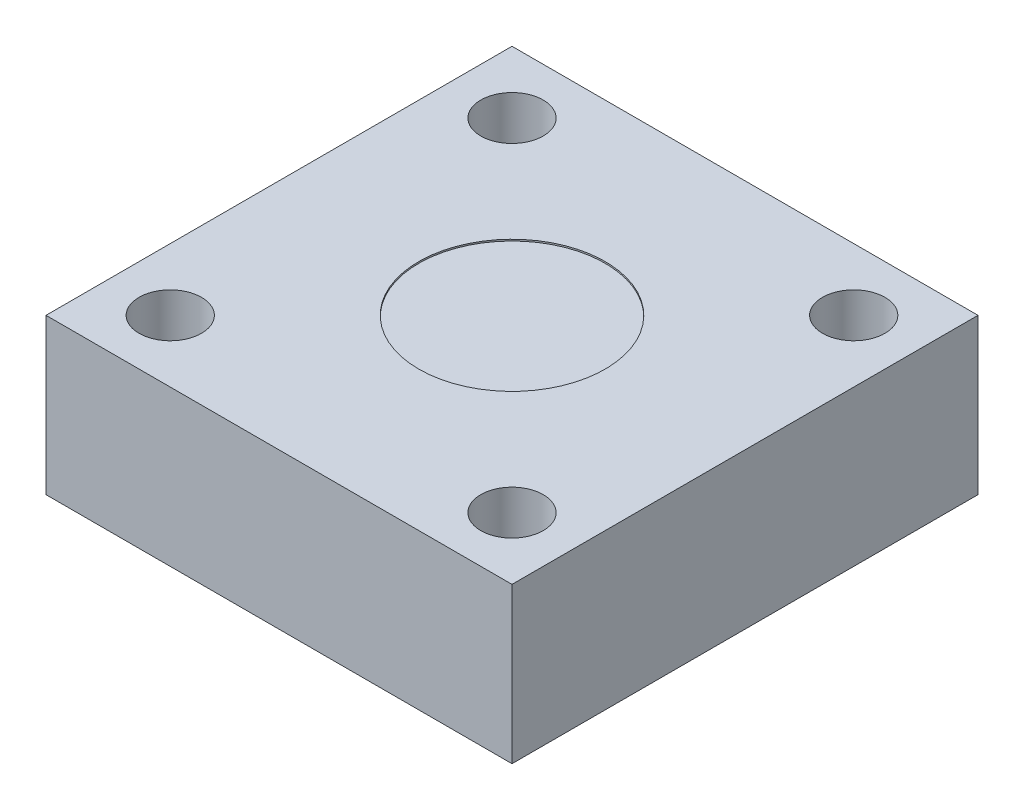
ISO-10303-21;
HEADER;
FILE_DESCRIPTION(('STEP AP214'),'2;1');
FILE_NAME('part.step','',(''),(''),'','','');
FILE_SCHEMA(('AUTOMOTIVE_DESIGN { 1 0 10303 214 1 1 1 1 }'));
ENDSEC;
DATA;
#1=APPLICATION_CONTEXT('core data for automotive mechanical design processes');
#2=APPLICATION_PROTOCOL_DEFINITION('international standard','automotive_design',2000,#1);
#3=PRODUCT_CONTEXT('',#1,'mechanical');
#4=PRODUCT('Part','Part','',(#3));
#5=PRODUCT_RELATED_PRODUCT_CATEGORY('part','',(#4));
#6=PRODUCT_DEFINITION_FORMATION('','',#4);
#7=PRODUCT_DEFINITION_CONTEXT('part definition',#1,'design');
#8=PRODUCT_DEFINITION('design','',#6,#7);
#9=PRODUCT_DEFINITION_SHAPE('','',#8);
#10=(LENGTH_UNIT() NAMED_UNIT(*) SI_UNIT(.MILLI.,.METRE.));
#11=(NAMED_UNIT(*) PLANE_ANGLE_UNIT() SI_UNIT($,.RADIAN.));
#12=(NAMED_UNIT(*) SI_UNIT($,.STERADIAN.) SOLID_ANGLE_UNIT());
#13=UNCERTAINTY_MEASURE_WITH_UNIT(LENGTH_MEASURE(1.E-05),#10,'distance_accuracy_value','');
#14=(GEOMETRIC_REPRESENTATION_CONTEXT(3) GLOBAL_UNCERTAINTY_ASSIGNED_CONTEXT((#13)) GLOBAL_UNIT_ASSIGNED_CONTEXT((#10,
#11,#12)) REPRESENTATION_CONTEXT('',''));
#15=CARTESIAN_POINT('',(0.,0.,0.));
#16=DIRECTION('',(0.,0.,1.));
#17=DIRECTION('',(1.,0.,0.));
#18=AXIS2_PLACEMENT_3D('',#15,#16,#17);
#19=CARTESIAN_POINT('',(19.05,12.7,-19.05));
#20=DIRECTION('',(-1.,0.,0.));
#21=DIRECTION('',(0.,0.,1.));
#22=AXIS2_PLACEMENT_3D('',#19,#20,#21);
#23=PLANE('',#22);
#24=DIRECTION('',(0.,0.,-1.));
#25=VECTOR('',#24,1.);
#26=CARTESIAN_POINT('',(19.05,0.,-19.05));
#27=LINE('',#26,#25);
#28=CARTESIAN_POINT('',(19.05,0.,19.05));
#29=VERTEX_POINT('',#28);
#30=CARTESIAN_POINT('',(19.05,0.,-19.05));
#31=VERTEX_POINT('',#30);
#32=EDGE_CURVE('E142',#29,#31,#27,.T.);
#33=ORIENTED_EDGE('',*,*,#32,.T.);
#34=DIRECTION('',(0.,-1.,0.));
#35=VECTOR('',#34,1.);
#36=CARTESIAN_POINT('',(19.05,12.7,-19.05));
#37=LINE('',#36,#35);
#38=CARTESIAN_POINT('',(19.05,12.7,-19.05));
#39=VERTEX_POINT('',#38);
#40=EDGE_CURVE('E13',#39,#31,#37,.T.);
#41=ORIENTED_EDGE('',*,*,#40,.F.);
#42=DIRECTION('',(0.,0.,-1.));
#43=VECTOR('',#42,1.);
#44=CARTESIAN_POINT('',(19.05,12.7,-19.05));
#45=LINE('',#44,#43);
#46=CARTESIAN_POINT('',(19.05,12.7,19.05));
#47=VERTEX_POINT('',#46);
#48=EDGE_CURVE('E145',#47,#39,#45,.T.);
#49=ORIENTED_EDGE('',*,*,#48,.F.);
#50=DIRECTION('',(0.,-1.,0.));
#51=VECTOR('',#50,1.);
#52=CARTESIAN_POINT('',(19.05,12.7,19.05));
#53=LINE('',#52,#51);
#54=EDGE_CURVE('E151',#47,#29,#53,.T.);
#55=ORIENTED_EDGE('',*,*,#54,.T.);
#56=EDGE_LOOP('',(#33,#41,#49,#55));
#57=FACE_BOUND('',#56,.T.);
#58=ADVANCED_FACE('F45',(#57),#23,.F.);
#59=CARTESIAN_POINT('',(-19.05,12.7,-19.05));
#60=DIRECTION('',(0.,0.,1.));
#61=DIRECTION('',(1.,0.,0.));
#62=AXIS2_PLACEMENT_3D('',#59,#60,#61);
#63=PLANE('',#62);
#64=DIRECTION('',(-1.,0.,0.));
#65=VECTOR('',#64,1.);
#66=CARTESIAN_POINT('',(-19.05,0.,-19.05));
#67=LINE('',#66,#65);
#68=CARTESIAN_POINT('',(-19.05,0.,-19.05));
#69=VERTEX_POINT('',#68);
#70=EDGE_CURVE('E154',#31,#69,#67,.T.);
#71=ORIENTED_EDGE('',*,*,#70,.T.);
#72=DIRECTION('',(0.,-1.,0.));
#73=VECTOR('',#72,1.);
#74=CARTESIAN_POINT('',(-19.05,12.7,-19.05));
#75=LINE('',#74,#73);
#76=CARTESIAN_POINT('',(-19.05,12.7,-19.05));
#77=VERTEX_POINT('',#76);
#78=EDGE_CURVE('E53',#77,#69,#75,.T.);
#79=ORIENTED_EDGE('',*,*,#78,.F.);
#80=DIRECTION('',(-1.,0.,0.));
#81=VECTOR('',#80,1.);
#82=CARTESIAN_POINT('',(-19.05,12.7,-19.05));
#83=LINE('',#82,#81);
#84=EDGE_CURVE('E92',#39,#77,#83,.T.);
#85=ORIENTED_EDGE('',*,*,#84,.F.);
#86=ORIENTED_EDGE('',*,*,#40,.T.);
#87=EDGE_LOOP('',(#71,#79,#85,#86));
#88=FACE_BOUND('',#87,.T.);
#89=ADVANCED_FACE('F178',(#88),#63,.F.);
#90=CARTESIAN_POINT('',(-19.05,12.7,-19.05));
#91=DIRECTION('',(1.,0.,0.));
#92=DIRECTION('',(0.,0.,-1.));
#93=AXIS2_PLACEMENT_3D('',#90,#91,#92);
#94=PLANE('',#93);
#95=DIRECTION('',(0.,0.,1.));
#96=VECTOR('',#95,1.);
#97=CARTESIAN_POINT('',(-19.05,0.,-19.05));
#98=LINE('',#97,#96);
#99=CARTESIAN_POINT('',(-19.05,0.,19.05));
#100=VERTEX_POINT('',#99);
#101=EDGE_CURVE('E79',#69,#100,#98,.T.);
#102=ORIENTED_EDGE('',*,*,#101,.T.);
#103=DIRECTION('',(0.,-1.,0.));
#104=VECTOR('',#103,1.);
#105=CARTESIAN_POINT('',(-19.05,12.7,19.05));
#106=LINE('',#105,#104);
#107=CARTESIAN_POINT('',(-19.05,12.7,19.05));
#108=VERTEX_POINT('',#107);
#109=EDGE_CURVE('E159',#108,#100,#106,.T.);
#110=ORIENTED_EDGE('',*,*,#109,.F.);
#111=DIRECTION('',(0.,0.,1.));
#112=VECTOR('',#111,1.);
#113=CARTESIAN_POINT('',(-19.05,12.7,-19.05));
#114=LINE('',#113,#112);
#115=EDGE_CURVE('E148',#77,#108,#114,.T.);
#116=ORIENTED_EDGE('',*,*,#115,.F.);
#117=ORIENTED_EDGE('',*,*,#78,.T.);
#118=EDGE_LOOP('',(#102,#110,#116,#117));
#119=FACE_BOUND('',#118,.T.);
#120=ADVANCED_FACE('F161',(#119),#94,.F.);
#121=CARTESIAN_POINT('',(-19.05,12.7,19.05));
#122=DIRECTION('',(0.,0.,-1.));
#123=DIRECTION('',(-1.,0.,0.));
#124=AXIS2_PLACEMENT_3D('',#121,#122,#123);
#125=PLANE('',#124);
#126=DIRECTION('',(1.,0.,0.));
#127=VECTOR('',#126,1.);
#128=CARTESIAN_POINT('',(-19.05,0.,19.05));
#129=LINE('',#128,#127);
#130=EDGE_CURVE('E85',#100,#29,#129,.T.);
#131=ORIENTED_EDGE('',*,*,#130,.T.);
#132=ORIENTED_EDGE('',*,*,#54,.F.);
#133=DIRECTION('',(1.,0.,0.));
#134=VECTOR('',#133,1.);
#135=CARTESIAN_POINT('',(-19.05,12.7,19.05));
#136=LINE('',#135,#134);
#137=EDGE_CURVE('E61',#108,#47,#136,.T.);
#138=ORIENTED_EDGE('',*,*,#137,.F.);
#139=ORIENTED_EDGE('',*,*,#109,.T.);
#140=EDGE_LOOP('',(#131,#132,#138,#139));
#141=FACE_BOUND('',#140,.T.);
#142=ADVANCED_FACE('F168',(#141),#125,.F.);
#143=CARTESIAN_POINT('',(0.,12.7,0.));
#144=DIRECTION('',(0.,1.,0.));
#145=DIRECTION('',(0.,0.,1.));
#146=AXIS2_PLACEMENT_3D('',#143,#144,#145);
#147=PLANE('',#146);
#148=CARTESIAN_POINT('',(-13.97,12.7,-13.97));
#149=DIRECTION('',(0.,1.,0.));
#150=DIRECTION('',(0.,0.,1.));
#151=AXIS2_PLACEMENT_3D('',#148,#149,#150);
#152=CIRCLE('',#151,2.55269999999999);
#153=CARTESIAN_POINT('',(-13.97,12.7,-11.4173));
#154=VERTEX_POINT('',#153);
#155=EDGE_CURVE('E116',#154,#154,#152,.T.);
#156=ORIENTED_EDGE('',*,*,#155,.F.);
#157=EDGE_LOOP('',(#156));
#158=FACE_BOUND('',#157,.T.);
#159=CARTESIAN_POINT('',(13.97,12.7,-13.97));
#160=DIRECTION('',(0.,1.,0.));
#161=DIRECTION('',(0.,0.,1.));
#162=AXIS2_PLACEMENT_3D('',#159,#160,#161);
#163=CIRCLE('',#162,2.55269999999999);
#164=CARTESIAN_POINT('',(13.97,12.7,-11.4173));
#165=VERTEX_POINT('',#164);
#166=EDGE_CURVE('E115',#165,#165,#163,.T.);
#167=ORIENTED_EDGE('',*,*,#166,.F.);
#168=EDGE_LOOP('',(#167));
#169=FACE_BOUND('',#168,.T.);
#170=CARTESIAN_POINT('',(13.97,12.7,13.97));
#171=DIRECTION('',(0.,1.,0.));
#172=DIRECTION('',(0.,0.,1.));
#173=AXIS2_PLACEMENT_3D('',#170,#171,#172);
#174=CIRCLE('',#173,2.55269999999999);
#175=CARTESIAN_POINT('',(13.97,12.7,16.5227));
#176=VERTEX_POINT('',#175);
#177=EDGE_CURVE('E126',#176,#176,#174,.T.);
#178=ORIENTED_EDGE('',*,*,#177,.F.);
#179=EDGE_LOOP('',(#178));
#180=FACE_BOUND('',#179,.T.);
#181=CARTESIAN_POINT('',(-13.97,12.7,13.97));
#182=DIRECTION('',(0.,1.,0.));
#183=DIRECTION('',(0.,0.,1.));
#184=AXIS2_PLACEMENT_3D('',#181,#182,#183);
#185=CIRCLE('',#184,2.55269999999999);
#186=CARTESIAN_POINT('',(-13.97,12.7,16.5227));
#187=VERTEX_POINT('',#186);
#188=EDGE_CURVE('E132',#187,#187,#185,.T.);
#189=ORIENTED_EDGE('',*,*,#188,.F.);
#190=EDGE_LOOP('',(#189));
#191=FACE_BOUND('',#190,.T.);
#192=CARTESIAN_POINT('',(0.,12.7,0.));
#193=DIRECTION('',(0.,1.,0.));
#194=DIRECTION('',(0.,0.,1.));
#195=AXIS2_PLACEMENT_3D('',#192,#193,#194);
#196=CIRCLE('',#195,7.62);
#197=CARTESIAN_POINT('',(0.,12.7,7.62));
#198=VERTEX_POINT('',#197);
#199=EDGE_CURVE('E138',#198,#198,#196,.T.);
#200=ORIENTED_EDGE('',*,*,#199,.F.);
#201=EDGE_LOOP('',(#200));
#202=FACE_BOUND('',#201,.T.);
#203=ORIENTED_EDGE('',*,*,#48,.T.);
#204=ORIENTED_EDGE('',*,*,#84,.T.);
#205=ORIENTED_EDGE('',*,*,#115,.T.);
#206=ORIENTED_EDGE('',*,*,#137,.T.);
#207=EDGE_LOOP('',(#203,#204,#205,#206));
#208=FACE_BOUND('',#207,.T.);
#209=ADVANCED_FACE('F170',(#158,#169,#180,#191,#202,#208),#147,.T.);
#210=CARTESIAN_POINT('',(0.,0.,0.));
#211=DIRECTION('',(0.,1.,0.));
#212=DIRECTION('',(0.,0.,1.));
#213=AXIS2_PLACEMENT_3D('',#210,#211,#212);
#214=PLANE('',#213);
#215=ORIENTED_EDGE('',*,*,#32,.F.);
#216=ORIENTED_EDGE('',*,*,#130,.F.);
#217=ORIENTED_EDGE('',*,*,#101,.F.);
#218=ORIENTED_EDGE('',*,*,#70,.F.);
#219=EDGE_LOOP('',(#215,#216,#217,#218));
#220=FACE_BOUND('',#219,.T.);
#221=ADVANCED_FACE('F164',(#220),#214,.F.);
#222=CARTESIAN_POINT('',(0.,12.573,0.));
#223=DIRECTION('',(0.,1.,0.));
#224=DIRECTION('',(0.,0.,1.));
#225=AXIS2_PLACEMENT_3D('',#222,#223,#224);
#226=CYLINDRICAL_SURFACE('',#225,7.62);
#227=CARTESIAN_POINT('',(0.,12.573,0.));
#228=DIRECTION('',(0.,1.,0.));
#229=DIRECTION('',(0.,0.,1.));
#230=AXIS2_PLACEMENT_3D('',#227,#228,#229);
#231=CIRCLE('',#230,7.62);
#232=CARTESIAN_POINT('',(0.,12.573,7.62));
#233=VERTEX_POINT('',#232);
#234=EDGE_CURVE('E139',#233,#233,#231,.T.);
#235=ORIENTED_EDGE('',*,*,#234,.F.);
#236=EDGE_LOOP('',(#235));
#237=FACE_BOUND('',#236,.T.);
#238=ORIENTED_EDGE('',*,*,#199,.T.);
#239=EDGE_LOOP('',(#238));
#240=FACE_BOUND('',#239,.T.);
#241=ADVANCED_FACE('F205',(#237,#240),#226,.F.);
#242=CARTESIAN_POINT('',(0.,12.573,0.));
#243=DIRECTION('',(0.,1.,0.));
#244=DIRECTION('',(0.,0.,1.));
#245=AXIS2_PLACEMENT_3D('',#242,#243,#244);
#246=PLANE('',#245);
#247=ORIENTED_EDGE('',*,*,#234,.T.);
#248=EDGE_LOOP('',(#247));
#249=FACE_BOUND('',#248,.T.);
#250=ADVANCED_FACE('F213',(#249),#246,.T.);
#251=CARTESIAN_POINT('',(-13.97,6.35,13.97));
#252=DIRECTION('',(0.,1.,0.));
#253=DIRECTION('',(0.,0.,1.));
#254=AXIS2_PLACEMENT_3D('',#251,#252,#253);
#255=CONICAL_SURFACE('',#254,2.55269999999999,1.02974425867665);
#256=CARTESIAN_POINT('',(-13.97,4.81618309780835,13.97));
#257=VERTEX_POINT('',#256);
#258=VERTEX_LOOP('',#257);
#259=FACE_BOUND('',#258,.T.);
#260=CARTESIAN_POINT('',(-13.97,6.35,13.97));
#261=DIRECTION('',(0.,1.,0.));
#262=DIRECTION('',(0.,0.,1.));
#263=AXIS2_PLACEMENT_3D('',#260,#261,#262);
#264=CIRCLE('',#263,2.55269999999999);
#265=CARTESIAN_POINT('',(-13.97,6.35,16.5227));
#266=VERTEX_POINT('',#265);
#267=EDGE_CURVE('E135',#266,#266,#264,.T.);
#268=ORIENTED_EDGE('',*,*,#267,.T.);
#269=EDGE_LOOP('',(#268));
#270=FACE_BOUND('',#269,.T.);
#271=ADVANCED_FACE('F223',(#259,#270),#255,.F.);
#272=CARTESIAN_POINT('',(-13.97,12.7,13.97));
#273=DIRECTION('',(0.,1.,0.));
#274=DIRECTION('',(0.,0.,1.));
#275=AXIS2_PLACEMENT_3D('',#272,#273,#274);
#276=CYLINDRICAL_SURFACE('',#275,2.55269999999999);
#277=ORIENTED_EDGE('',*,*,#267,.F.);
#278=EDGE_LOOP('',(#277));
#279=FACE_BOUND('',#278,.T.);
#280=ORIENTED_EDGE('',*,*,#188,.T.);
#281=EDGE_LOOP('',(#280));
#282=FACE_BOUND('',#281,.T.);
#283=ADVANCED_FACE('F238',(#279,#282),#276,.F.);
#284=CARTESIAN_POINT('',(13.97,6.35,13.97));
#285=DIRECTION('',(0.,1.,0.));
#286=DIRECTION('',(0.,0.,1.));
#287=AXIS2_PLACEMENT_3D('',#284,#285,#286);
#288=CONICAL_SURFACE('',#287,2.55269999999999,1.02974425867665);
#289=CARTESIAN_POINT('',(13.97,4.81618309780835,13.97));
#290=VERTEX_POINT('',#289);
#291=VERTEX_LOOP('',#290);
#292=FACE_BOUND('',#291,.T.);
#293=CARTESIAN_POINT('',(13.97,6.35,13.97));
#294=DIRECTION('',(0.,1.,0.));
#295=DIRECTION('',(0.,0.,1.));
#296=AXIS2_PLACEMENT_3D('',#293,#294,#295);
#297=CIRCLE('',#296,2.55269999999999);
#298=CARTESIAN_POINT('',(13.97,6.35,16.5227));
#299=VERTEX_POINT('',#298);
#300=EDGE_CURVE('E129',#299,#299,#297,.T.);
#301=ORIENTED_EDGE('',*,*,#300,.T.);
#302=EDGE_LOOP('',(#301));
#303=FACE_BOUND('',#302,.T.);
#304=ADVANCED_FACE('F248',(#292,#303),#288,.F.);
#305=CARTESIAN_POINT('',(13.97,12.7,13.97));
#306=DIRECTION('',(0.,1.,0.));
#307=DIRECTION('',(0.,0.,1.));
#308=AXIS2_PLACEMENT_3D('',#305,#306,#307);
#309=CYLINDRICAL_SURFACE('',#308,2.55269999999999);
#310=ORIENTED_EDGE('',*,*,#300,.F.);
#311=EDGE_LOOP('',(#310));
#312=FACE_BOUND('',#311,.T.);
#313=ORIENTED_EDGE('',*,*,#177,.T.);
#314=EDGE_LOOP('',(#313));
#315=FACE_BOUND('',#314,.T.);
#316=ADVANCED_FACE('F258',(#312,#315),#309,.F.);
#317=CARTESIAN_POINT('',(13.97,6.35,-13.97));
#318=DIRECTION('',(0.,1.,0.));
#319=DIRECTION('',(0.,0.,1.));
#320=AXIS2_PLACEMENT_3D('',#317,#318,#319);
#321=CONICAL_SURFACE('',#320,2.55269999999999,1.02974425867665);
#322=CARTESIAN_POINT('',(13.97,4.81618309780835,-13.97));
#323=VERTEX_POINT('',#322);
#324=VERTEX_LOOP('',#323);
#325=FACE_BOUND('',#324,.T.);
#326=CARTESIAN_POINT('',(13.97,6.35,-13.97));
#327=DIRECTION('',(0.,1.,0.));
#328=DIRECTION('',(0.,0.,1.));
#329=AXIS2_PLACEMENT_3D('',#326,#327,#328);
#330=CIRCLE('',#329,2.55269999999999);
#331=CARTESIAN_POINT('',(13.97,6.35,-11.4173));
#332=VERTEX_POINT('',#331);
#333=EDGE_CURVE('E119',#332,#332,#330,.T.);
#334=ORIENTED_EDGE('',*,*,#333,.T.);
#335=EDGE_LOOP('',(#334));
#336=FACE_BOUND('',#335,.T.);
#337=ADVANCED_FACE('F268',(#325,#336),#321,.F.);
#338=CARTESIAN_POINT('',(13.97,12.7,-13.97));
#339=DIRECTION('',(0.,1.,0.));
#340=DIRECTION('',(0.,0.,1.));
#341=AXIS2_PLACEMENT_3D('',#338,#339,#340);
#342=CYLINDRICAL_SURFACE('',#341,2.55269999999999);
#343=ORIENTED_EDGE('',*,*,#333,.F.);
#344=EDGE_LOOP('',(#343));
#345=FACE_BOUND('',#344,.T.);
#346=ORIENTED_EDGE('',*,*,#166,.T.);
#347=EDGE_LOOP('',(#346));
#348=FACE_BOUND('',#347,.T.);
#349=ADVANCED_FACE('F109',(#345,#348),#342,.F.);
#350=CARTESIAN_POINT('',(-13.97,6.35,-13.97));
#351=DIRECTION('',(0.,1.,0.));
#352=DIRECTION('',(0.,0.,1.));
#353=AXIS2_PLACEMENT_3D('',#350,#351,#352);
#354=CONICAL_SURFACE('',#353,2.55269999999999,1.02974425867665);
#355=CARTESIAN_POINT('',(-13.97,4.81618309780835,-13.97));
#356=VERTEX_POINT('',#355);
#357=VERTEX_LOOP('',#356);
#358=FACE_BOUND('',#357,.T.);
#359=CARTESIAN_POINT('',(-13.97,6.35,-13.97));
#360=DIRECTION('',(0.,1.,0.));
#361=DIRECTION('',(0.,0.,1.));
#362=AXIS2_PLACEMENT_3D('',#359,#360,#361);
#363=CIRCLE('',#362,2.55269999999999);
#364=CARTESIAN_POINT('',(-13.97,6.35,-11.4173));
#365=VERTEX_POINT('',#364);
#366=EDGE_CURVE('E113',#365,#365,#363,.T.);
#367=ORIENTED_EDGE('',*,*,#366,.T.);
#368=EDGE_LOOP('',(#367));
#369=FACE_BOUND('',#368,.T.);
#370=ADVANCED_FACE('F105',(#358,#369),#354,.F.);
#371=CARTESIAN_POINT('',(-13.97,12.7,-13.97));
#372=DIRECTION('',(0.,1.,0.));
#373=DIRECTION('',(0.,0.,1.));
#374=AXIS2_PLACEMENT_3D('',#371,#372,#373);
#375=CYLINDRICAL_SURFACE('',#374,2.55269999999999);
#376=ORIENTED_EDGE('',*,*,#366,.F.);
#377=EDGE_LOOP('',(#376));
#378=FACE_BOUND('',#377,.T.);
#379=ORIENTED_EDGE('',*,*,#155,.T.);
#380=EDGE_LOOP('',(#379));
#381=FACE_BOUND('',#380,.T.);
#382=ADVANCED_FACE('F108',(#378,#381),#375,.F.);
#383=CLOSED_SHELL('',(#58,#89,#120,#142,#209,#221,#241,#250,#271,#283,#304,#316,#337,#349,#370,#382));
#384=MANIFOLD_SOLID_BREP('B2',#383);
#385=ADVANCED_BREP_SHAPE_REPRESENTATION('',(#18,#384),#14);
#386=SHAPE_DEFINITION_REPRESENTATION(#9,#385);
ENDSEC;
END-ISO-10303-21;
